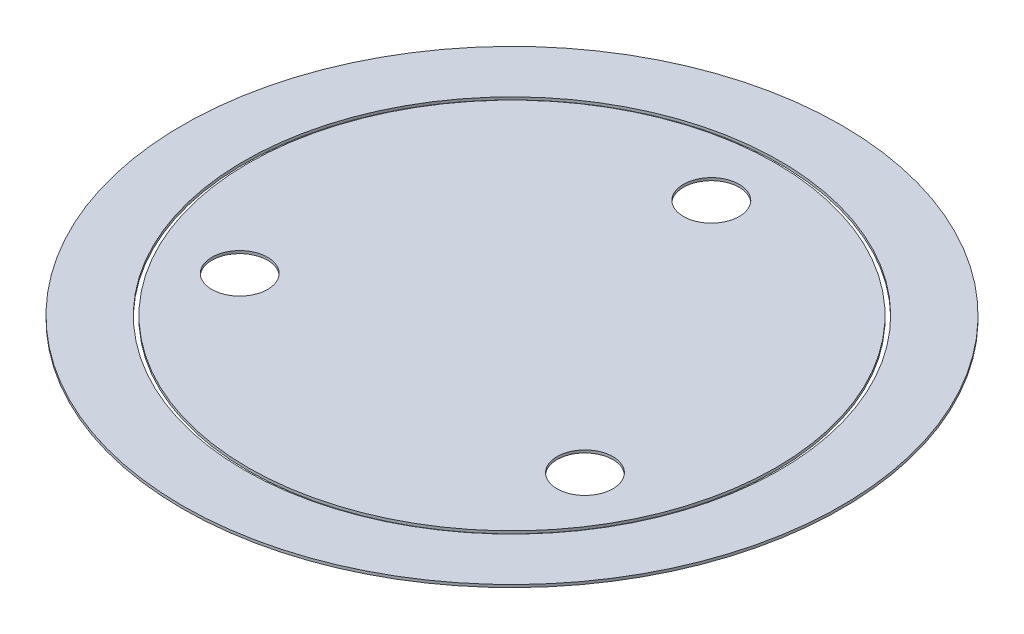
ISO-10303-21;
HEADER;
FILE_DESCRIPTION(('STEP AP214'),'2;1');
FILE_NAME('part.step','',(''),(''),'','','');
FILE_SCHEMA(('AUTOMOTIVE_DESIGN { 1 0 10303 214 1 1 1 1 }'));
ENDSEC;
DATA;
#1=APPLICATION_CONTEXT('core data for automotive mechanical design processes');
#2=APPLICATION_PROTOCOL_DEFINITION('international standard','automotive_design',2000,#1);
#3=PRODUCT_CONTEXT('',#1,'mechanical');
#4=PRODUCT('Part','Part','',(#3));
#5=PRODUCT_RELATED_PRODUCT_CATEGORY('part','',(#4));
#6=PRODUCT_DEFINITION_FORMATION('','',#4);
#7=PRODUCT_DEFINITION_CONTEXT('part definition',#1,'design');
#8=PRODUCT_DEFINITION('design','',#6,#7);
#9=PRODUCT_DEFINITION_SHAPE('','',#8);
#10=(LENGTH_UNIT() NAMED_UNIT(*) SI_UNIT(.MILLI.,.METRE.));
#11=(NAMED_UNIT(*) PLANE_ANGLE_UNIT() SI_UNIT($,.RADIAN.));
#12=(NAMED_UNIT(*) SI_UNIT($,.STERADIAN.) SOLID_ANGLE_UNIT());
#13=UNCERTAINTY_MEASURE_WITH_UNIT(LENGTH_MEASURE(1.E-05),#10,'distance_accuracy_value','');
#14=(GEOMETRIC_REPRESENTATION_CONTEXT(3) GLOBAL_UNCERTAINTY_ASSIGNED_CONTEXT((#13)) GLOBAL_UNIT_ASSIGNED_CONTEXT((#10,
#11,#12)) REPRESENTATION_CONTEXT('',''));
#15=CARTESIAN_POINT('',(0.,0.,0.));
#16=DIRECTION('',(0.,0.,1.));
#17=DIRECTION('',(1.,0.,0.));
#18=AXIS2_PLACEMENT_3D('',#15,#16,#17);
#19=CARTESIAN_POINT('',(0.,0.2,-15.));
#20=DIRECTION('',(0.,-1.,0.));
#21=DIRECTION('',(0.,0.,-1.));
#22=AXIS2_PLACEMENT_3D('',#19,#20,#21);
#23=CYLINDRICAL_SURFACE('',#22,2.1);
#24=CARTESIAN_POINT('',(0.,0.2,-15.));
#25=DIRECTION('',(0.,1.,0.));
#26=DIRECTION('',(0.,0.,1.));
#27=AXIS2_PLACEMENT_3D('',#24,#25,#26);
#28=CIRCLE('',#27,2.1);
#29=CARTESIAN_POINT('',(0.,0.2,-12.9));
#30=VERTEX_POINT('',#29);
#31=EDGE_CURVE('E53',#30,#30,#28,.T.);
#32=ORIENTED_EDGE('',*,*,#31,.T.);
#33=EDGE_LOOP('',(#32));
#34=FACE_BOUND('',#33,.T.);
#35=CARTESIAN_POINT('',(0.,0.,-15.));
#36=DIRECTION('',(0.,1.,0.));
#37=DIRECTION('',(0.,0.,1.));
#38=AXIS2_PLACEMENT_3D('',#35,#36,#37);
#39=CIRCLE('',#38,2.1);
#40=CARTESIAN_POINT('',(0.,0.,-12.9));
#41=VERTEX_POINT('',#40);
#42=EDGE_CURVE('E67',#41,#41,#39,.T.);
#43=ORIENTED_EDGE('',*,*,#42,.F.);
#44=EDGE_LOOP('',(#43));
#45=FACE_BOUND('',#44,.T.);
#46=ADVANCED_FACE('F45',(#34,#45),#23,.F.);
#47=CARTESIAN_POINT('',(12.9903810567665,0.2,7.50000000000006));
#48=DIRECTION('',(0.,-1.,0.));
#49=DIRECTION('',(0.,0.,-1.));
#50=AXIS2_PLACEMENT_3D('',#47,#48,#49);
#51=CYLINDRICAL_SURFACE('',#50,2.1);
#52=CARTESIAN_POINT('',(12.9903810567665,0.2,7.50000000000006));
#53=DIRECTION('',(0.,1.,0.));
#54=DIRECTION('',(0.,0.,1.));
#55=AXIS2_PLACEMENT_3D('',#52,#53,#54);
#56=CIRCLE('',#55,2.1);
#57=CARTESIAN_POINT('',(12.9903810567665,0.2,9.60000000000006));
#58=VERTEX_POINT('',#57);
#59=EDGE_CURVE('E58',#58,#58,#56,.T.);
#60=ORIENTED_EDGE('',*,*,#59,.T.);
#61=EDGE_LOOP('',(#60));
#62=FACE_BOUND('',#61,.T.);
#63=CARTESIAN_POINT('',(12.9903810567665,0.,7.50000000000006));
#64=DIRECTION('',(0.,1.,0.));
#65=DIRECTION('',(0.,0.,1.));
#66=AXIS2_PLACEMENT_3D('',#63,#64,#65);
#67=CIRCLE('',#66,2.1);
#68=CARTESIAN_POINT('',(12.9903810567665,0.,9.60000000000006));
#69=VERTEX_POINT('',#68);
#70=EDGE_CURVE('E65',#69,#69,#67,.T.);
#71=ORIENTED_EDGE('',*,*,#70,.F.);
#72=EDGE_LOOP('',(#71));
#73=FACE_BOUND('',#72,.T.);
#74=ADVANCED_FACE('F82',(#62,#73),#51,.F.);
#75=CARTESIAN_POINT('',(-12.9903810567665,0.2,7.50000000000006));
#76=DIRECTION('',(0.,-1.,0.));
#77=DIRECTION('',(0.,0.,-1.));
#78=AXIS2_PLACEMENT_3D('',#75,#76,#77);
#79=CYLINDRICAL_SURFACE('',#78,2.1);
#80=CARTESIAN_POINT('',(-12.9903810567665,0.2,7.50000000000006));
#81=DIRECTION('',(0.,1.,0.));
#82=DIRECTION('',(0.,0.,1.));
#83=AXIS2_PLACEMENT_3D('',#80,#81,#82);
#84=CIRCLE('',#83,2.1);
#85=CARTESIAN_POINT('',(-12.9903810567665,0.2,9.60000000000006));
#86=VERTEX_POINT('',#85);
#87=EDGE_CURVE('E72',#86,#86,#84,.T.);
#88=ORIENTED_EDGE('',*,*,#87,.T.);
#89=EDGE_LOOP('',(#88));
#90=FACE_BOUND('',#89,.T.);
#91=CARTESIAN_POINT('',(-12.9903810567665,0.,7.50000000000006));
#92=DIRECTION('',(0.,1.,0.));
#93=DIRECTION('',(0.,0.,1.));
#94=AXIS2_PLACEMENT_3D('',#91,#92,#93);
#95=CIRCLE('',#94,2.1);
#96=CARTESIAN_POINT('',(-12.9903810567665,0.,9.60000000000006));
#97=VERTEX_POINT('',#96);
#98=EDGE_CURVE('E62',#97,#97,#95,.T.);
#99=ORIENTED_EDGE('',*,*,#98,.F.);
#100=EDGE_LOOP('',(#99));
#101=FACE_BOUND('',#100,.T.);
#102=ADVANCED_FACE('F47',(#90,#101),#79,.F.);
#103=CARTESIAN_POINT('',(0.,0.2,0.));
#104=DIRECTION('',(0.,-1.,0.));
#105=DIRECTION('',(0.,0.,-1.));
#106=AXIS2_PLACEMENT_3D('',#103,#104,#105);
#107=CYLINDRICAL_SURFACE('',#106,19.85);
#108=CARTESIAN_POINT('',(0.,0.2,0.));
#109=DIRECTION('',(0.,1.,0.));
#110=DIRECTION('',(0.,0.,1.));
#111=AXIS2_PLACEMENT_3D('',#108,#109,#110);
#112=CIRCLE('',#111,19.85);
#113=CARTESIAN_POINT('',(0.,0.2,19.85));
#114=VERTEX_POINT('',#113);
#115=EDGE_CURVE('E12',#114,#114,#112,.T.);
#116=ORIENTED_EDGE('',*,*,#115,.F.);
#117=EDGE_LOOP('',(#116));
#118=FACE_BOUND('',#117,.T.);
#119=CARTESIAN_POINT('',(0.,0.,0.));
#120=DIRECTION('',(0.,1.,0.));
#121=DIRECTION('',(0.,0.,1.));
#122=AXIS2_PLACEMENT_3D('',#119,#120,#121);
#123=CIRCLE('',#122,19.85);
#124=CARTESIAN_POINT('',(0.,0.,19.85));
#125=VERTEX_POINT('',#124);
#126=EDGE_CURVE('E49',#125,#125,#123,.T.);
#127=ORIENTED_EDGE('',*,*,#126,.T.);
#128=EDGE_LOOP('',(#127));
#129=FACE_BOUND('',#128,.T.);
#130=ADVANCED_FACE('F89',(#118,#129),#107,.T.);
#131=CARTESIAN_POINT('',(0.,0.2,0.));
#132=DIRECTION('',(0.,1.,0.));
#133=DIRECTION('',(0.,0.,1.));
#134=AXIS2_PLACEMENT_3D('',#131,#132,#133);
#135=PLANE('',#134);
#136=ORIENTED_EDGE('',*,*,#87,.F.);
#137=EDGE_LOOP('',(#136));
#138=FACE_BOUND('',#137,.T.);
#139=ORIENTED_EDGE('',*,*,#59,.F.);
#140=EDGE_LOOP('',(#139));
#141=FACE_BOUND('',#140,.T.);
#142=ORIENTED_EDGE('',*,*,#31,.F.);
#143=EDGE_LOOP('',(#142));
#144=FACE_BOUND('',#143,.T.);
#145=ORIENTED_EDGE('',*,*,#115,.T.);
#146=EDGE_LOOP('',(#145));
#147=FACE_BOUND('',#146,.T.);
#148=ADVANCED_FACE('F85',(#138,#141,#144,#147),#135,.T.);
#149=CARTESIAN_POINT('',(0.,0.,0.));
#150=DIRECTION('',(0.,1.,0.));
#151=DIRECTION('',(0.,0.,1.));
#152=AXIS2_PLACEMENT_3D('',#149,#150,#151);
#153=PLANE('',#152);
#154=ORIENTED_EDGE('',*,*,#98,.T.);
#155=EDGE_LOOP('',(#154));
#156=FACE_BOUND('',#155,.T.);
#157=ORIENTED_EDGE('',*,*,#70,.T.);
#158=EDGE_LOOP('',(#157));
#159=FACE_BOUND('',#158,.T.);
#160=ORIENTED_EDGE('',*,*,#42,.T.);
#161=EDGE_LOOP('',(#160));
#162=FACE_BOUND('',#161,.T.);
#163=ORIENTED_EDGE('',*,*,#126,.F.);
#164=EDGE_LOOP('',(#163));
#165=FACE_BOUND('',#164,.T.);
#166=ADVANCED_FACE('F88',(#156,#159,#162,#165),#153,.F.);
#167=CLOSED_SHELL('',(#46,#74,#102,#130,#148,#166));
#168=MANIFOLD_SOLID_BREP('B2',#167);
#169=CARTESIAN_POINT('',(0.,0.2,0.));
#170=DIRECTION('',(0.,-1.,0.));
#171=DIRECTION('',(0.,0.,-1.));
#172=AXIS2_PLACEMENT_3D('',#169,#170,#171);
#173=CYLINDRICAL_SURFACE('',#172,20.15);
#174=CARTESIAN_POINT('',(0.,0.2,0.));
#175=DIRECTION('',(0.,1.,0.));
#176=DIRECTION('',(0.,0.,1.));
#177=AXIS2_PLACEMENT_3D('',#174,#175,#176);
#178=CIRCLE('',#177,20.15);
#179=CARTESIAN_POINT('',(0.,0.2,20.15));
#180=VERTEX_POINT('',#179);
#181=EDGE_CURVE('E156',#180,#180,#178,.T.);
#182=ORIENTED_EDGE('',*,*,#181,.T.);
#183=EDGE_LOOP('',(#182));
#184=FACE_BOUND('',#183,.T.);
#185=CARTESIAN_POINT('',(0.,0.,0.));
#186=DIRECTION('',(0.,1.,0.));
#187=DIRECTION('',(0.,0.,1.));
#188=AXIS2_PLACEMENT_3D('',#185,#186,#187);
#189=CIRCLE('',#188,20.15);
#190=CARTESIAN_POINT('',(0.,0.,20.15));
#191=VERTEX_POINT('',#190);
#192=EDGE_CURVE('E162',#191,#191,#189,.T.);
#193=ORIENTED_EDGE('',*,*,#192,.F.);
#194=EDGE_LOOP('',(#193));
#195=FACE_BOUND('',#194,.T.);
#196=ADVANCED_FACE('F149',(#184,#195),#173,.F.);
#197=CARTESIAN_POINT('',(0.,0.2,0.));
#198=DIRECTION('',(0.,-1.,0.));
#199=DIRECTION('',(0.,0.,-1.));
#200=AXIS2_PLACEMENT_3D('',#197,#198,#199);
#201=CYLINDRICAL_SURFACE('',#200,24.8);
#202=CARTESIAN_POINT('',(0.,0.2,0.));
#203=DIRECTION('',(0.,1.,0.));
#204=DIRECTION('',(0.,0.,1.));
#205=AXIS2_PLACEMENT_3D('',#202,#203,#204);
#206=CIRCLE('',#205,24.8);
#207=CARTESIAN_POINT('',(0.,0.2,24.8));
#208=VERTEX_POINT('',#207);
#209=EDGE_CURVE('E44',#208,#208,#206,.T.);
#210=ORIENTED_EDGE('',*,*,#209,.F.);
#211=EDGE_LOOP('',(#210));
#212=FACE_BOUND('',#211,.T.);
#213=CARTESIAN_POINT('',(0.,0.,0.));
#214=DIRECTION('',(0.,1.,0.));
#215=DIRECTION('',(0.,0.,1.));
#216=AXIS2_PLACEMENT_3D('',#213,#214,#215);
#217=CIRCLE('',#216,24.8);
#218=CARTESIAN_POINT('',(0.,0.,24.8));
#219=VERTEX_POINT('',#218);
#220=EDGE_CURVE('E152',#219,#219,#217,.T.);
#221=ORIENTED_EDGE('',*,*,#220,.T.);
#222=EDGE_LOOP('',(#221));
#223=FACE_BOUND('',#222,.T.);
#224=ADVANCED_FACE('F169',(#212,#223),#201,.T.);
#225=CARTESIAN_POINT('',(0.,0.2,0.));
#226=DIRECTION('',(0.,1.,0.));
#227=DIRECTION('',(0.,0.,1.));
#228=AXIS2_PLACEMENT_3D('',#225,#226,#227);
#229=PLANE('',#228);
#230=ORIENTED_EDGE('',*,*,#181,.F.);
#231=EDGE_LOOP('',(#230));
#232=FACE_BOUND('',#231,.T.);
#233=ORIENTED_EDGE('',*,*,#209,.T.);
#234=EDGE_LOOP('',(#233));
#235=FACE_BOUND('',#234,.T.);
#236=ADVANCED_FACE('F173',(#232,#235),#229,.T.);
#237=CARTESIAN_POINT('',(0.,0.,0.));
#238=DIRECTION('',(0.,1.,0.));
#239=DIRECTION('',(0.,0.,1.));
#240=AXIS2_PLACEMENT_3D('',#237,#238,#239);
#241=PLANE('',#240);
#242=ORIENTED_EDGE('',*,*,#192,.T.);
#243=EDGE_LOOP('',(#242));
#244=FACE_BOUND('',#243,.T.);
#245=ORIENTED_EDGE('',*,*,#220,.F.);
#246=EDGE_LOOP('',(#245));
#247=FACE_BOUND('',#246,.T.);
#248=ADVANCED_FACE('F171',(#244,#247),#241,.F.);
#249=CLOSED_SHELL('',(#196,#224,#236,#248));
#250=MANIFOLD_SOLID_BREP('B7',#249);
#251=ADVANCED_BREP_SHAPE_REPRESENTATION('',(#18,#168,#250),#14);
#252=SHAPE_DEFINITION_REPRESENTATION(#9,#251);
ENDSEC;
END-ISO-10303-21;
